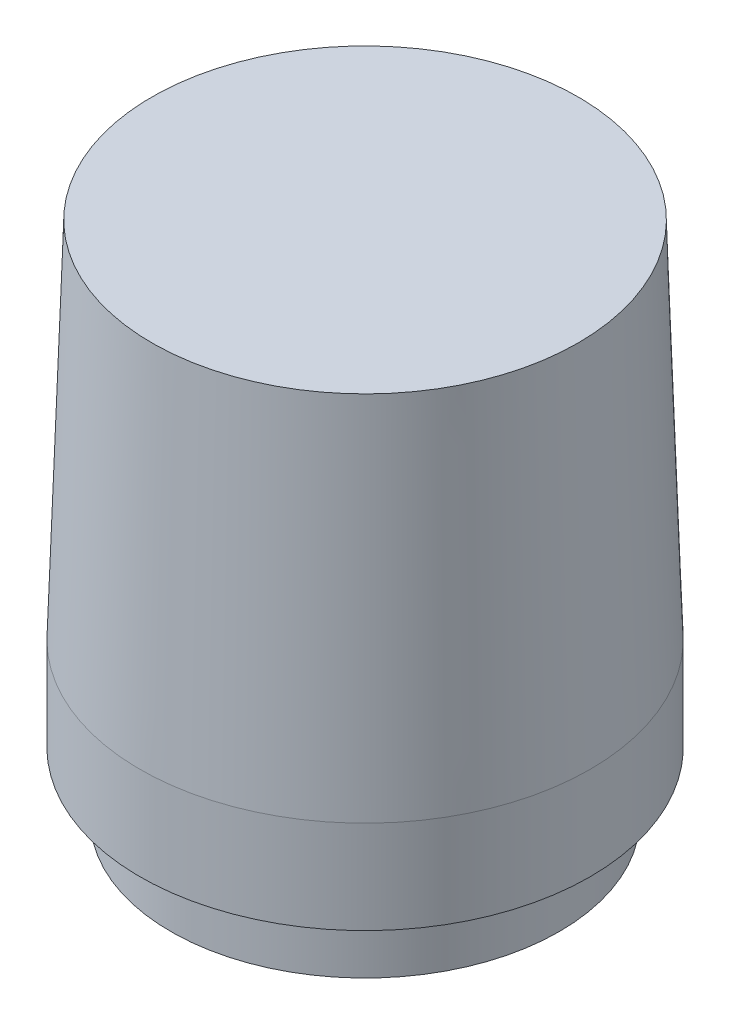
ISO-10303-21;
HEADER;
FILE_DESCRIPTION(('STEP AP214'),'2;1');
FILE_NAME('part.step','',(''),(''),'','','');
FILE_SCHEMA(('AUTOMOTIVE_DESIGN { 1 0 10303 214 1 1 1 1 }'));
ENDSEC;
DATA;
#1=APPLICATION_CONTEXT('core data for automotive mechanical design processes');
#2=APPLICATION_PROTOCOL_DEFINITION('international standard','automotive_design',2000,#1);
#3=PRODUCT_CONTEXT('',#1,'mechanical');
#4=PRODUCT('Part','Part','',(#3));
#5=PRODUCT_RELATED_PRODUCT_CATEGORY('part','',(#4));
#6=PRODUCT_DEFINITION_FORMATION('','',#4);
#7=PRODUCT_DEFINITION_CONTEXT('part definition',#1,'design');
#8=PRODUCT_DEFINITION('design','',#6,#7);
#9=PRODUCT_DEFINITION_SHAPE('','',#8);
#10=(LENGTH_UNIT() NAMED_UNIT(*) SI_UNIT(.MILLI.,.METRE.));
#11=(NAMED_UNIT(*) PLANE_ANGLE_UNIT() SI_UNIT($,.RADIAN.));
#12=(NAMED_UNIT(*) SI_UNIT($,.STERADIAN.) SOLID_ANGLE_UNIT());
#13=UNCERTAINTY_MEASURE_WITH_UNIT(LENGTH_MEASURE(1.E-05),#10,'distance_accuracy_value','');
#14=(GEOMETRIC_REPRESENTATION_CONTEXT(3) GLOBAL_UNCERTAINTY_ASSIGNED_CONTEXT((#13)) GLOBAL_UNIT_ASSIGNED_CONTEXT((#10,
#11,#12)) REPRESENTATION_CONTEXT('',''));
#15=CARTESIAN_POINT('',(0.,0.,0.));
#16=DIRECTION('',(0.,0.,1.));
#17=DIRECTION('',(1.,0.,0.));
#18=AXIS2_PLACEMENT_3D('',#15,#16,#17);
#19=CARTESIAN_POINT('',(7.725,0.,0.));
#20=DIRECTION('',(0.,-1.,0.));
#21=DIRECTION('',(0.,0.,-1.));
#22=AXIS2_PLACEMENT_3D('',#19,#20,#21);
#23=PLANE('',#22);
#24=CARTESIAN_POINT('',(0.,0.,0.));
#25=DIRECTION('',(0.,-1.,0.));
#26=DIRECTION('',(1.,0.,0.));
#27=AXIS2_PLACEMENT_3D('',#24,#25,#26);
#28=CIRCLE('',#27,15.45);
#29=CARTESIAN_POINT('',(15.45,0.,0.));
#30=VERTEX_POINT('',#29);
#31=EDGE_CURVE('E18',#30,#30,#28,.F.);
#32=ORIENTED_EDGE('',*,*,#31,.F.);
#33=EDGE_LOOP('',(#32));
#34=FACE_BOUND('',#33,.T.);
#35=ADVANCED_FACE('F15',(#34),#23,.T.);
#36=CARTESIAN_POINT('',(0.,2.5,0.));
#37=DIRECTION('',(0.,-1.,0.));
#38=DIRECTION('',(1.,0.,0.));
#39=AXIS2_PLACEMENT_3D('',#36,#37,#38);
#40=CYLINDRICAL_SURFACE('',#39,15.45);
#41=CARTESIAN_POINT('',(0.,5.,0.));
#42=DIRECTION('',(0.,-1.,0.));
#43=DIRECTION('',(1.,0.,0.));
#44=AXIS2_PLACEMENT_3D('',#41,#42,#43);
#45=CIRCLE('',#44,15.45);
#46=CARTESIAN_POINT('',(15.45,5.,0.));
#47=VERTEX_POINT('',#46);
#48=EDGE_CURVE('E33',#47,#47,#45,.F.);
#49=ORIENTED_EDGE('',*,*,#48,.F.);
#50=EDGE_LOOP('',(#49));
#51=FACE_BOUND('',#50,.T.);
#52=ORIENTED_EDGE('',*,*,#31,.T.);
#53=EDGE_LOOP('',(#52));
#54=FACE_BOUND('',#53,.T.);
#55=ADVANCED_FACE('F40',(#51,#54),#40,.T.);
#56=CARTESIAN_POINT('',(16.675,5.,0.));
#57=DIRECTION('',(0.,-1.,0.));
#58=DIRECTION('',(0.,0.,-1.));
#59=AXIS2_PLACEMENT_3D('',#56,#57,#58);
#60=PLANE('',#59);
#61=ORIENTED_EDGE('',*,*,#48,.T.);
#62=EDGE_LOOP('',(#61));
#63=FACE_BOUND('',#62,.T.);
#64=CARTESIAN_POINT('',(0.,4.99999999999999,0.));
#65=DIRECTION('',(0.,-1.,0.));
#66=DIRECTION('',(1.,0.,0.));
#67=AXIS2_PLACEMENT_3D('',#64,#65,#66);
#68=CIRCLE('',#67,17.9);
#69=CARTESIAN_POINT('',(17.9,5.,0.));
#70=VERTEX_POINT('',#69);
#71=EDGE_CURVE('E27',#70,#70,#68,.F.);
#72=ORIENTED_EDGE('',*,*,#71,.F.);
#73=EDGE_LOOP('',(#72));
#74=FACE_BOUND('',#73,.T.);
#75=ADVANCED_FACE('F47',(#63,#74),#60,.T.);
#76=CARTESIAN_POINT('',(0.,8.7,0.));
#77=DIRECTION('',(0.,-1.,0.));
#78=DIRECTION('',(1.,0.,0.));
#79=AXIS2_PLACEMENT_3D('',#76,#77,#78);
#80=CYLINDRICAL_SURFACE('',#79,17.9);
#81=CARTESIAN_POINT('',(0.,12.3999999999821,0.));
#82=DIRECTION('',(0.,-1.,0.));
#83=DIRECTION('',(1.,0.,0.));
#84=AXIS2_PLACEMENT_3D('',#81,#82,#83);
#85=CIRCLE('',#84,17.8999999994574);
#86=CARTESIAN_POINT('',(17.8999999994574,12.3999999999821,0.));
#87=VERTEX_POINT('',#86);
#88=EDGE_CURVE('E22',#87,#87,#85,.F.);
#89=ORIENTED_EDGE('',*,*,#88,.F.);
#90=EDGE_LOOP('',(#89));
#91=FACE_BOUND('',#90,.T.);
#92=ORIENTED_EDGE('',*,*,#71,.T.);
#93=EDGE_LOOP('',(#92));
#94=FACE_BOUND('',#93,.T.);
#95=ADVANCED_FACE('F56',(#91,#94),#80,.T.);
#96=CARTESIAN_POINT('',(8.47499999999999,41.3,0.));
#97=DIRECTION('',(0.,1.,0.));
#98=DIRECTION('',(0.,0.,1.));
#99=AXIS2_PLACEMENT_3D('',#96,#97,#98);
#100=PLANE('',#99);
#101=CARTESIAN_POINT('',(0.,41.3000000000178,0.));
#102=DIRECTION('',(0.,-1.,0.));
#103=DIRECTION('',(1.,0.,0.));
#104=AXIS2_PLACEMENT_3D('',#101,#102,#103);
#105=CIRCLE('',#104,16.9500000005426);
#106=CARTESIAN_POINT('',(16.9500000005426,41.3000000000178,0.));
#107=VERTEX_POINT('',#106);
#108=EDGE_CURVE('E10',#107,#107,#105,.T.);
#109=ORIENTED_EDGE('',*,*,#108,.F.);
#110=EDGE_LOOP('',(#109));
#111=FACE_BOUND('',#110,.T.);
#112=ADVANCED_FACE('F51',(#111),#100,.T.);
#113=CARTESIAN_POINT('',(0.,12.3999999999821,0.));
#114=DIRECTION('',(0.,-1.,0.));
#115=DIRECTION('',(1.,0.,0.));
#116=AXIS2_PLACEMENT_3D('',#113,#114,#115);
#117=CONICAL_SURFACE('',#116,17.8999999994574,0.0328601398332316);
#118=ORIENTED_EDGE('',*,*,#108,.T.);
#119=EDGE_LOOP('',(#118));
#120=FACE_BOUND('',#119,.T.);
#121=ORIENTED_EDGE('',*,*,#88,.T.);
#122=EDGE_LOOP('',(#121));
#123=FACE_BOUND('',#122,.T.);
#124=ADVANCED_FACE('F49',(#120,#123),#117,.T.);
#125=CLOSED_SHELL('',(#35,#55,#75,#95,#112,#124));
#126=MANIFOLD_SOLID_BREP('B1',#125);
#127=ADVANCED_BREP_SHAPE_REPRESENTATION('',(#18,#126),#14);
#128=SHAPE_DEFINITION_REPRESENTATION(#9,#127);
ENDSEC;
END-ISO-10303-21;
